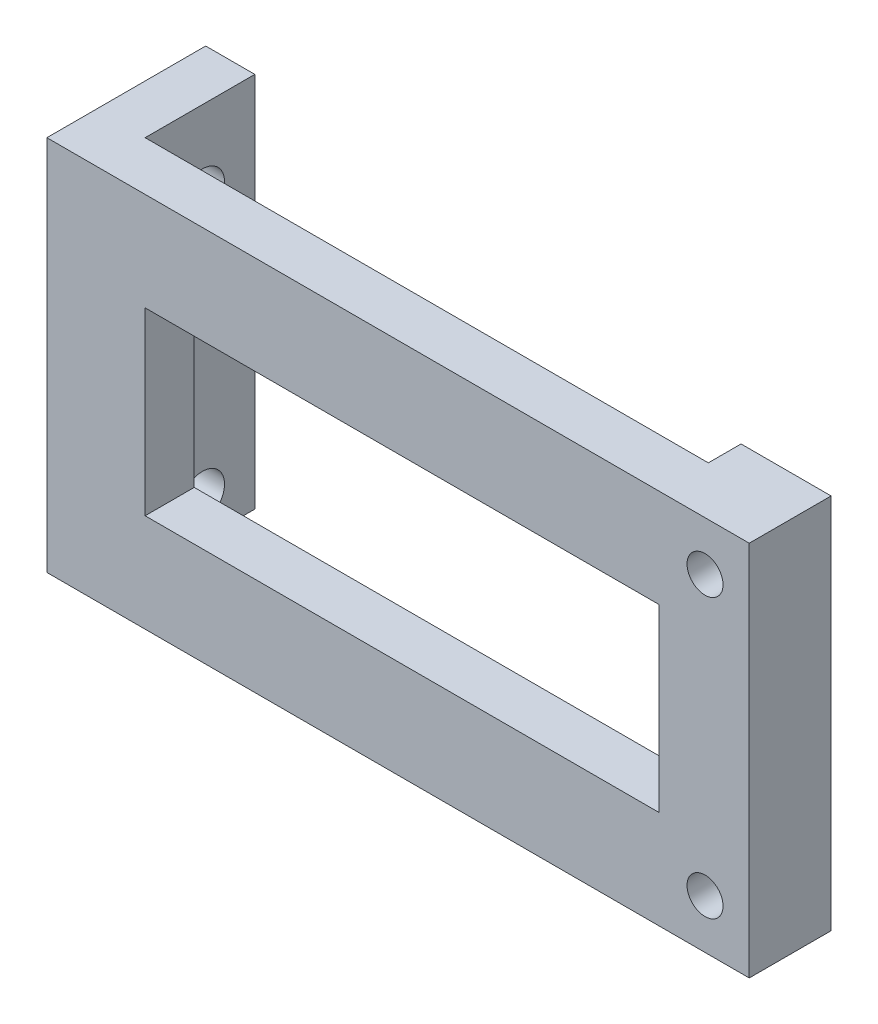
ISO-10303-21;
HEADER;
FILE_DESCRIPTION(('STEP AP214'),'2;1');
FILE_NAME('part.step','',(''),(''),'','','');
FILE_SCHEMA(('AUTOMOTIVE_DESIGN { 1 0 10303 214 1 1 1 1 }'));
ENDSEC;
DATA;
#1=APPLICATION_CONTEXT('core data for automotive mechanical design processes');
#2=APPLICATION_PROTOCOL_DEFINITION('international standard','automotive_design',2000,#1);
#3=PRODUCT_CONTEXT('',#1,'mechanical');
#4=PRODUCT('Part','Part','',(#3));
#5=PRODUCT_RELATED_PRODUCT_CATEGORY('part','',(#4));
#6=PRODUCT_DEFINITION_FORMATION('','',#4);
#7=PRODUCT_DEFINITION_CONTEXT('part definition',#1,'design');
#8=PRODUCT_DEFINITION('design','',#6,#7);
#9=PRODUCT_DEFINITION_SHAPE('','',#8);
#10=(LENGTH_UNIT() NAMED_UNIT(*) SI_UNIT(.MILLI.,.METRE.));
#11=(NAMED_UNIT(*) PLANE_ANGLE_UNIT() SI_UNIT($,.RADIAN.));
#12=(NAMED_UNIT(*) SI_UNIT($,.STERADIAN.) SOLID_ANGLE_UNIT());
#13=UNCERTAINTY_MEASURE_WITH_UNIT(LENGTH_MEASURE(1.E-05),#10,'distance_accuracy_value','');
#14=(GEOMETRIC_REPRESENTATION_CONTEXT(3) GLOBAL_UNCERTAINTY_ASSIGNED_CONTEXT((#13)) GLOBAL_UNIT_ASSIGNED_CONTEXT((#10,
#11,#12)) REPRESENTATION_CONTEXT('',''));
#15=CARTESIAN_POINT('',(0.,0.,0.));
#16=DIRECTION('',(0.,0.,1.));
#17=DIRECTION('',(1.,0.,0.));
#18=AXIS2_PLACEMENT_3D('',#15,#16,#17);
#19=CARTESIAN_POINT('',(0.,-5.50000000000001,-3.00000000000004));
#20=DIRECTION('',(0.,-1.,0.));
#21=DIRECTION('',(0.,0.,-1.));
#22=AXIS2_PLACEMENT_3D('',#19,#20,#21);
#23=PLANE('',#22);
#24=DIRECTION('',(1.,0.,0.));
#25=VECTOR('',#24,1.);
#26=CARTESIAN_POINT('',(0.,-5.50000000000017,0.));
#27=LINE('',#26,#25);
#28=CARTESIAN_POINT('',(-15.45,-5.50000000000014,0.));
#29=VERTEX_POINT('',#28);
#30=CARTESIAN_POINT('',(15.9500000000002,-5.50000000000017,0.));
#31=VERTEX_POINT('',#30);
#32=EDGE_CURVE('E75',#29,#31,#27,.T.);
#33=ORIENTED_EDGE('',*,*,#32,.T.);
#34=DIRECTION('',(0.,0.,1.));
#35=VECTOR('',#34,1.);
#36=CARTESIAN_POINT('',(15.95,-5.50000000000017,-3.));
#37=LINE('',#36,#35);
#38=CARTESIAN_POINT('',(15.95,-5.50000000000017,-3.));
#39=VERTEX_POINT('',#38);
#40=EDGE_CURVE('E11',#39,#31,#37,.T.);
#41=ORIENTED_EDGE('',*,*,#40,.F.);
#42=DIRECTION('',(1.,0.,0.));
#43=VECTOR('',#42,1.);
#44=CARTESIAN_POINT('',(0.,-5.50000000000001,-3.00000000000004));
#45=LINE('',#44,#43);
#46=CARTESIAN_POINT('',(-15.4499999999999,-5.50000000000014,-2.99999999999996));
#47=VERTEX_POINT('',#46);
#48=EDGE_CURVE('E54',#47,#39,#45,.T.);
#49=ORIENTED_EDGE('',*,*,#48,.F.);
#50=DIRECTION('',(0.,0.,1.));
#51=VECTOR('',#50,1.);
#52=CARTESIAN_POINT('',(-15.4499999999999,-5.50000000000014,-2.99999999999996));
#53=LINE('',#52,#51);
#54=EDGE_CURVE('E39',#47,#29,#53,.T.);
#55=ORIENTED_EDGE('',*,*,#54,.T.);
#56=EDGE_LOOP('',(#33,#41,#49,#55));
#57=FACE_BOUND('',#56,.T.);
#58=ADVANCED_FACE('F36',(#57),#23,.F.);
#59=CARTESIAN_POINT('',(0.,-11.5,-3.));
#60=DIRECTION('',(0.,1.,0.));
#61=DIRECTION('',(-1.,0.,0.));
#62=AXIS2_PLACEMENT_3D('',#59,#60,#61);
#63=PLANE('',#62);
#64=DIRECTION('',(-1.,0.,0.));
#65=VECTOR('',#64,1.);
#66=CARTESIAN_POINT('',(0.,-11.5000000000002,0.));
#67=LINE('',#66,#65);
#68=CARTESIAN_POINT('',(21.4500000000002,-11.5000000000001,0.));
#69=VERTEX_POINT('',#68);
#70=CARTESIAN_POINT('',(-21.45,-11.5,0.));
#71=VERTEX_POINT('',#70);
#72=EDGE_CURVE('E176',#69,#71,#67,.T.);
#73=ORIENTED_EDGE('',*,*,#72,.T.);
#74=DIRECTION('',(0.,0.,1.));
#75=VECTOR('',#74,1.);
#76=CARTESIAN_POINT('',(-21.4499999999999,-11.5,-9.7));
#77=LINE('',#76,#75);
#78=CARTESIAN_POINT('',(-21.4499999999999,-11.5,-9.7));
#79=VERTEX_POINT('',#78);
#80=EDGE_CURVE('E128',#79,#71,#77,.T.);
#81=ORIENTED_EDGE('',*,*,#80,.F.);
#82=DIRECTION('',(-1.,0.,0.));
#83=VECTOR('',#82,1.);
#84=CARTESIAN_POINT('',(1.66533453693773E-13,-11.5000000000002,-9.70000000000001));
#85=LINE('',#84,#83);
#86=CARTESIAN_POINT('',(-18.45,-11.5,-9.7));
#87=VERTEX_POINT('',#86);
#88=EDGE_CURVE('E125',#87,#79,#85,.T.);
#89=ORIENTED_EDGE('',*,*,#88,.F.);
#90=DIRECTION('',(0.,0.,1.));
#91=VECTOR('',#90,1.);
#92=CARTESIAN_POINT('',(-18.45,-11.5,-9.7));
#93=LINE('',#92,#91);
#94=CARTESIAN_POINT('',(-18.45,-11.5000000000002,-3.));
#95=VERTEX_POINT('',#94);
#96=EDGE_CURVE('E157',#87,#95,#93,.T.);
#97=ORIENTED_EDGE('',*,*,#96,.T.);
#98=DIRECTION('',(-1.,0.,0.));
#99=VECTOR('',#98,1.);
#100=CARTESIAN_POINT('',(0.,-11.5,-3.));
#101=LINE('',#100,#99);
#102=CARTESIAN_POINT('',(15.9500000000002,-11.5000000000002,-3.));
#103=VERTEX_POINT('',#102);
#104=EDGE_CURVE('E100',#103,#95,#101,.T.);
#105=ORIENTED_EDGE('',*,*,#104,.F.);
#106=DIRECTION('',(0.,0.,1.));
#107=VECTOR('',#106,1.);
#108=CARTESIAN_POINT('',(15.9500000000002,-11.5000000000002,-5.));
#109=LINE('',#108,#107);
#110=CARTESIAN_POINT('',(15.9500000000002,-11.5000000000002,-5.));
#111=VERTEX_POINT('',#110);
#112=EDGE_CURVE('E171',#111,#103,#109,.T.);
#113=ORIENTED_EDGE('',*,*,#112,.F.);
#114=DIRECTION('',(-1.,0.,0.));
#115=VECTOR('',#114,1.);
#116=CARTESIAN_POINT('',(1.66533453693773E-13,-11.5,-5.));
#117=LINE('',#116,#115);
#118=CARTESIAN_POINT('',(21.4500000000002,-11.5000000000001,-5.));
#119=VERTEX_POINT('',#118);
#120=EDGE_CURVE('E147',#119,#111,#117,.T.);
#121=ORIENTED_EDGE('',*,*,#120,.F.);
#122=DIRECTION('',(0.,0.,1.));
#123=VECTOR('',#122,1.);
#124=CARTESIAN_POINT('',(21.4500000000002,-11.5000000000001,-5.));
#125=LINE('',#124,#123);
#126=EDGE_CURVE('E168',#119,#69,#125,.T.);
#127=ORIENTED_EDGE('',*,*,#126,.T.);
#128=EDGE_LOOP('',(#73,#81,#89,#97,#105,#113,#121,#127));
#129=FACE_BOUND('',#128,.T.);
#130=ADVANCED_FACE('F200',(#129),#63,.F.);
#131=CARTESIAN_POINT('',(1.66533453693773E-13,11.5,-3.));
#132=DIRECTION('',(0.,1.,0.));
#133=DIRECTION('',(-1.,0.,0.));
#134=AXIS2_PLACEMENT_3D('',#131,#132,#133);
#135=PLANE('',#134);
#136=DIRECTION('',(-1.,0.,0.));
#137=VECTOR('',#136,1.);
#138=CARTESIAN_POINT('',(1.66533453693773E-13,11.4999999999998,0.));
#139=LINE('',#138,#137);
#140=CARTESIAN_POINT('',(21.45,11.4999999999998,0.));
#141=VERTEX_POINT('',#140);
#142=CARTESIAN_POINT('',(-21.45,11.5,0.));
#143=VERTEX_POINT('',#142);
#144=EDGE_CURVE('E190',#141,#143,#139,.T.);
#145=ORIENTED_EDGE('',*,*,#144,.F.);
#146=DIRECTION('',(0.,0.,1.));
#147=VECTOR('',#146,1.);
#148=CARTESIAN_POINT('',(21.4500000000002,11.4999999999998,-4.99999999999996));
#149=LINE('',#148,#147);
#150=CARTESIAN_POINT('',(21.4500000000002,11.4999999999998,-4.99999999999996));
#151=VERTEX_POINT('',#150);
#152=EDGE_CURVE('E165',#151,#141,#149,.T.);
#153=ORIENTED_EDGE('',*,*,#152,.F.);
#154=DIRECTION('',(-1.,0.,0.));
#155=VECTOR('',#154,1.);
#156=CARTESIAN_POINT('',(1.66533453693773E-13,11.5,-5.));
#157=LINE('',#156,#155);
#158=CARTESIAN_POINT('',(15.9500000000002,11.4999999999998,-4.99999999999996));
#159=VERTEX_POINT('',#158);
#160=EDGE_CURVE('E142',#151,#159,#157,.T.);
#161=ORIENTED_EDGE('',*,*,#160,.T.);
#162=DIRECTION('',(0.,0.,1.));
#163=VECTOR('',#162,1.);
#164=CARTESIAN_POINT('',(15.9500000000002,11.4999999999998,-4.99999999999996));
#165=LINE('',#164,#163);
#166=CARTESIAN_POINT('',(15.95,11.4999999999998,-3.));
#167=VERTEX_POINT('',#166);
#168=EDGE_CURVE('E117',#159,#167,#165,.T.);
#169=ORIENTED_EDGE('',*,*,#168,.T.);
#170=DIRECTION('',(-1.,0.,0.));
#171=VECTOR('',#170,1.);
#172=CARTESIAN_POINT('',(1.66533453693773E-13,11.5,-3.));
#173=LINE('',#172,#171);
#174=CARTESIAN_POINT('',(-18.4499999999997,11.4999999999998,-3.));
#175=VERTEX_POINT('',#174);
#176=EDGE_CURVE('E96',#167,#175,#173,.T.);
#177=ORIENTED_EDGE('',*,*,#176,.T.);
#178=DIRECTION('',(0.,0.,1.));
#179=VECTOR('',#178,1.);
#180=CARTESIAN_POINT('',(-18.45,11.4999999999998,-9.7));
#181=LINE('',#180,#179);
#182=CARTESIAN_POINT('',(-18.45,11.4999999999998,-9.7));
#183=VERTEX_POINT('',#182);
#184=EDGE_CURVE('E113',#183,#175,#181,.T.);
#185=ORIENTED_EDGE('',*,*,#184,.F.);
#186=DIRECTION('',(-1.,0.,0.));
#187=VECTOR('',#186,1.);
#188=CARTESIAN_POINT('',(0.,11.4999999999998,-9.7));
#189=LINE('',#188,#187);
#190=CARTESIAN_POINT('',(-21.45,11.5,-9.7));
#191=VERTEX_POINT('',#190);
#192=EDGE_CURVE('E251',#183,#191,#189,.T.);
#193=ORIENTED_EDGE('',*,*,#192,.T.);
#194=DIRECTION('',(0.,0.,1.));
#195=VECTOR('',#194,1.);
#196=CARTESIAN_POINT('',(-21.45,11.5,-9.7));
#197=LINE('',#196,#195);
#198=EDGE_CURVE('E124',#191,#143,#197,.T.);
#199=ORIENTED_EDGE('',*,*,#198,.T.);
#200=EDGE_LOOP('',(#145,#153,#161,#169,#177,#185,#193,#199));
#201=FACE_BOUND('',#200,.T.);
#202=ADVANCED_FACE('F110',(#201),#135,.T.);
#203=CARTESIAN_POINT('',(1.38777878078145E-13,5.49999999999984,-3.));
#204=DIRECTION('',(0.,-1.,0.));
#205=DIRECTION('',(1.,0.,0.));
#206=AXIS2_PLACEMENT_3D('',#203,#204,#205);
#207=PLANE('',#206);
#208=DIRECTION('',(1.,0.,0.));
#209=VECTOR('',#208,1.);
#210=CARTESIAN_POINT('',(1.66533453693773E-13,5.49999999999967,0.));
#211=LINE('',#210,#209);
#212=CARTESIAN_POINT('',(-15.45,5.49999999999984,0.));
#213=VERTEX_POINT('',#212);
#214=CARTESIAN_POINT('',(15.95,5.49999999999984,0.));
#215=VERTEX_POINT('',#214);
#216=EDGE_CURVE('E187',#213,#215,#211,.T.);
#217=ORIENTED_EDGE('',*,*,#216,.F.);
#218=DIRECTION('',(0.,0.,1.));
#219=VECTOR('',#218,1.);
#220=CARTESIAN_POINT('',(-15.45,5.49999999999984,-3.));
#221=LINE('',#220,#219);
#222=CARTESIAN_POINT('',(-15.45,5.49999999999984,-3.));
#223=VERTEX_POINT('',#222);
#224=EDGE_CURVE('E68',#223,#213,#221,.T.);
#225=ORIENTED_EDGE('',*,*,#224,.F.);
#226=DIRECTION('',(1.,0.,0.));
#227=VECTOR('',#226,1.);
#228=CARTESIAN_POINT('',(1.38777878078145E-13,5.49999999999984,-3.));
#229=LINE('',#228,#227);
#230=CARTESIAN_POINT('',(15.9500000000002,5.49999999999984,-3.));
#231=VERTEX_POINT('',#230);
#232=EDGE_CURVE('E178',#223,#231,#229,.T.);
#233=ORIENTED_EDGE('',*,*,#232,.T.);
#234=DIRECTION('',(0.,0.,1.));
#235=VECTOR('',#234,1.);
#236=CARTESIAN_POINT('',(15.9500000000002,5.49999999999984,-3.));
#237=LINE('',#236,#235);
#238=EDGE_CURVE('E45',#231,#215,#237,.T.);
#239=ORIENTED_EDGE('',*,*,#238,.T.);
#240=EDGE_LOOP('',(#217,#225,#233,#239));
#241=FACE_BOUND('',#240,.T.);
#242=ADVANCED_FACE('F291',(#241),#207,.T.);
#243=CARTESIAN_POINT('',(-15.45,-1.66533453693773E-13,-3.));
#244=DIRECTION('',(-1.,0.,0.));
#245=DIRECTION('',(0.,0.,1.));
#246=AXIS2_PLACEMENT_3D('',#243,#244,#245);
#247=PLANE('',#246);
#248=DIRECTION('',(0.,-1.,0.));
#249=VECTOR('',#248,1.);
#250=CARTESIAN_POINT('',(-15.45,-1.66533453693773E-13,0.));
#251=LINE('',#250,#249);
#252=EDGE_CURVE('E185',#213,#29,#251,.T.);
#253=ORIENTED_EDGE('',*,*,#252,.T.);
#254=ORIENTED_EDGE('',*,*,#54,.F.);
#255=DIRECTION('',(0.,-1.,0.));
#256=VECTOR('',#255,1.);
#257=CARTESIAN_POINT('',(-15.45,-1.66533453693773E-13,-3.));
#258=LINE('',#257,#256);
#259=EDGE_CURVE('E79',#223,#47,#258,.T.);
#260=ORIENTED_EDGE('',*,*,#259,.F.);
#261=ORIENTED_EDGE('',*,*,#224,.T.);
#262=EDGE_LOOP('',(#253,#254,#260,#261));
#263=FACE_BOUND('',#262,.T.);
#264=ADVANCED_FACE('F296',(#263),#247,.F.);
#265=CARTESIAN_POINT('',(0.,-1.66533453693773E-13,-3.));
#266=DIRECTION('',(0.,0.,1.));
#267=DIRECTION('',(1.,0.,0.));
#268=AXIS2_PLACEMENT_3D('',#265,#266,#267);
#269=PLANE('',#268);
#270=ORIENTED_EDGE('',*,*,#48,.T.);
#271=DIRECTION('',(0.,-1.,0.));
#272=VECTOR('',#271,1.);
#273=CARTESIAN_POINT('',(15.9500000000002,-1.66533453693773E-13,-3.));
#274=LINE('',#273,#272);
#275=EDGE_CURVE('E181',#39,#103,#274,.T.);
#276=ORIENTED_EDGE('',*,*,#275,.T.);
#277=ORIENTED_EDGE('',*,*,#104,.T.);
#278=DIRECTION('',(0.,-1.,0.));
#279=VECTOR('',#278,1.);
#280=CARTESIAN_POINT('',(-18.45,-1.66533453693773E-13,-3.));
#281=LINE('',#280,#279);
#282=EDGE_CURVE('E93',#175,#95,#281,.T.);
#283=ORIENTED_EDGE('',*,*,#282,.F.);
#284=ORIENTED_EDGE('',*,*,#176,.F.);
#285=EDGE_CURVE('E118',#167,#231,#274,.T.);
#286=ORIENTED_EDGE('',*,*,#285,.T.);
#287=ORIENTED_EDGE('',*,*,#232,.F.);
#288=ORIENTED_EDGE('',*,*,#259,.T.);
#289=EDGE_LOOP('',(#270,#276,#277,#283,#284,#286,#287,#288));
#290=FACE_BOUND('',#289,.T.);
#291=ADVANCED_FACE('F95',(#290),#269,.F.);
#292=CARTESIAN_POINT('',(0.,0.,0.));
#293=DIRECTION('',(0.,0.,1.));
#294=DIRECTION('',(1.,0.,0.));
#295=AXIS2_PLACEMENT_3D('',#292,#293,#294);
#296=PLANE('',#295);
#297=ORIENTED_EDGE('',*,*,#216,.T.);
#298=DIRECTION('',(0.,-1.,0.));
#299=VECTOR('',#298,1.);
#300=CARTESIAN_POINT('',(15.9500000000002,0.,0.));
#301=LINE('',#300,#299);
#302=EDGE_CURVE('E160',#215,#31,#301,.T.);
#303=ORIENTED_EDGE('',*,*,#302,.T.);
#304=ORIENTED_EDGE('',*,*,#32,.F.);
#305=ORIENTED_EDGE('',*,*,#252,.F.);
#306=EDGE_LOOP('',(#297,#303,#304,#305));
#307=FACE_BOUND('',#306,.T.);
#308=DIRECTION('',(0.,-1.,0.));
#309=VECTOR('',#308,1.);
#310=CARTESIAN_POINT('',(21.4500000000002,-1.66533453693773E-13,0.));
#311=LINE('',#310,#309);
#312=EDGE_CURVE('E139',#141,#69,#311,.T.);
#313=ORIENTED_EDGE('',*,*,#312,.F.);
#314=ORIENTED_EDGE('',*,*,#144,.T.);
#315=DIRECTION('',(0.,-1.,0.));
#316=VECTOR('',#315,1.);
#317=CARTESIAN_POINT('',(-21.4499999999997,-1.66533453693773E-13,0.));
#318=LINE('',#317,#316);
#319=EDGE_CURVE('E248',#143,#71,#318,.T.);
#320=ORIENTED_EDGE('',*,*,#319,.T.);
#321=ORIENTED_EDGE('',*,*,#72,.F.);
#322=EDGE_LOOP('',(#313,#314,#320,#321));
#323=FACE_BOUND('',#322,.T.);
#324=CARTESIAN_POINT('',(18.7500000000002,8.49999999999998,0.));
#325=DIRECTION('',(0.,0.,1.));
#326=DIRECTION('',(1.,0.,0.));
#327=AXIS2_PLACEMENT_3D('',#324,#325,#326);
#328=CIRCLE('',#327,1.1);
#329=CARTESIAN_POINT('',(19.8500000000002,8.49999999999998,0.));
#330=VERTEX_POINT('',#329);
#331=EDGE_CURVE('E153',#330,#330,#328,.T.);
#332=ORIENTED_EDGE('',*,*,#331,.F.);
#333=EDGE_LOOP('',(#332));
#334=FACE_BOUND('',#333,.T.);
#335=CARTESIAN_POINT('',(18.75,-8.50000000000001,0.));
#336=DIRECTION('',(0.,0.,1.));
#337=DIRECTION('',(1.,0.,0.));
#338=AXIS2_PLACEMENT_3D('',#335,#336,#337);
#339=CIRCLE('',#338,1.1);
#340=CARTESIAN_POINT('',(19.85,-8.50000000000001,0.));
#341=VERTEX_POINT('',#340);
#342=EDGE_CURVE('E156',#341,#341,#339,.T.);
#343=ORIENTED_EDGE('',*,*,#342,.F.);
#344=EDGE_LOOP('',(#343));
#345=FACE_BOUND('',#344,.T.);
#346=ADVANCED_FACE('F260',(#307,#323,#334,#345),#296,.T.);
#347=CARTESIAN_POINT('',(15.95,-1.66533453693773E-13,-5.));
#348=DIRECTION('',(-1.,0.,0.));
#349=DIRECTION('',(0.,-1.,0.));
#350=AXIS2_PLACEMENT_3D('',#347,#348,#349);
#351=PLANE('',#350);
#352=ORIENTED_EDGE('',*,*,#302,.F.);
#353=ORIENTED_EDGE('',*,*,#238,.F.);
#354=ORIENTED_EDGE('',*,*,#285,.F.);
#355=ORIENTED_EDGE('',*,*,#168,.F.);
#356=DIRECTION('',(0.,-1.,0.));
#357=VECTOR('',#356,1.);
#358=CARTESIAN_POINT('',(15.95,-1.66533453693773E-13,-5.));
#359=LINE('',#358,#357);
#360=EDGE_CURVE('E144',#159,#111,#359,.T.);
#361=ORIENTED_EDGE('',*,*,#360,.T.);
#362=ORIENTED_EDGE('',*,*,#112,.T.);
#363=ORIENTED_EDGE('',*,*,#275,.F.);
#364=ORIENTED_EDGE('',*,*,#40,.T.);
#365=EDGE_LOOP('',(#352,#353,#354,#355,#361,#362,#363,#364));
#366=FACE_BOUND('',#365,.T.);
#367=ADVANCED_FACE('F205',(#366),#351,.T.);
#368=CARTESIAN_POINT('',(21.4500000000002,-1.66533453693773E-13,-4.99999999999996));
#369=DIRECTION('',(-1.,0.,0.));
#370=DIRECTION('',(0.,-1.,0.));
#371=AXIS2_PLACEMENT_3D('',#368,#369,#370);
#372=PLANE('',#371);
#373=ORIENTED_EDGE('',*,*,#312,.T.);
#374=ORIENTED_EDGE('',*,*,#126,.F.);
#375=DIRECTION('',(0.,-1.,0.));
#376=VECTOR('',#375,1.);
#377=CARTESIAN_POINT('',(21.4500000000002,-1.66533453693773E-13,-4.99999999999996));
#378=LINE('',#377,#376);
#379=EDGE_CURVE('E150',#151,#119,#378,.T.);
#380=ORIENTED_EDGE('',*,*,#379,.F.);
#381=ORIENTED_EDGE('',*,*,#152,.T.);
#382=EDGE_LOOP('',(#373,#374,#380,#381));
#383=FACE_BOUND('',#382,.T.);
#384=ADVANCED_FACE('F222',(#383),#372,.F.);
#385=CARTESIAN_POINT('',(18.75,-8.50000000000017,-5.));
#386=DIRECTION('',(0.,0.,1.));
#387=DIRECTION('',(1.,0.,0.));
#388=AXIS2_PLACEMENT_3D('',#385,#386,#387);
#389=CYLINDRICAL_SURFACE('',#388,1.1);
#390=CARTESIAN_POINT('',(18.75,-8.50000000000017,-5.));
#391=DIRECTION('',(0.,0.,1.));
#392=DIRECTION('',(1.,0.,0.));
#393=AXIS2_PLACEMENT_3D('',#390,#391,#392);
#394=CIRCLE('',#393,1.1);
#395=CARTESIAN_POINT('',(19.85,-8.50000000000017,-5.));
#396=VERTEX_POINT('',#395);
#397=EDGE_CURVE('E138',#396,#396,#394,.T.);
#398=ORIENTED_EDGE('',*,*,#397,.F.);
#399=EDGE_LOOP('',(#398));
#400=FACE_BOUND('',#399,.T.);
#401=ORIENTED_EDGE('',*,*,#342,.T.);
#402=EDGE_LOOP('',(#401));
#403=FACE_BOUND('',#402,.T.);
#404=ADVANCED_FACE('F269',(#400,#403),#389,.F.);
#405=CARTESIAN_POINT('',(18.75,8.49999999999981,-5.));
#406=DIRECTION('',(0.,0.,1.));
#407=DIRECTION('',(1.,0.,0.));
#408=AXIS2_PLACEMENT_3D('',#405,#406,#407);
#409=CYLINDRICAL_SURFACE('',#408,1.1);
#410=CARTESIAN_POINT('',(18.75,8.49999999999981,-5.));
#411=DIRECTION('',(0.,0.,1.));
#412=DIRECTION('',(1.,0.,0.));
#413=AXIS2_PLACEMENT_3D('',#410,#411,#412);
#414=CIRCLE('',#413,1.1);
#415=CARTESIAN_POINT('',(19.85,8.49999999999981,-5.));
#416=VERTEX_POINT('',#415);
#417=EDGE_CURVE('E135',#416,#416,#414,.T.);
#418=ORIENTED_EDGE('',*,*,#417,.F.);
#419=EDGE_LOOP('',(#418));
#420=FACE_BOUND('',#419,.T.);
#421=ORIENTED_EDGE('',*,*,#331,.T.);
#422=EDGE_LOOP('',(#421));
#423=FACE_BOUND('',#422,.T.);
#424=ADVANCED_FACE('F271',(#420,#423),#409,.F.);
#425=CARTESIAN_POINT('',(0.,-1.66533453693773E-13,-5.));
#426=DIRECTION('',(0.,0.,1.));
#427=DIRECTION('',(1.,0.,0.));
#428=AXIS2_PLACEMENT_3D('',#425,#426,#427);
#429=PLANE('',#428);
#430=ORIENTED_EDGE('',*,*,#417,.T.);
#431=EDGE_LOOP('',(#430));
#432=FACE_BOUND('',#431,.T.);
#433=ORIENTED_EDGE('',*,*,#397,.T.);
#434=EDGE_LOOP('',(#433));
#435=FACE_BOUND('',#434,.T.);
#436=ORIENTED_EDGE('',*,*,#160,.F.);
#437=ORIENTED_EDGE('',*,*,#379,.T.);
#438=ORIENTED_EDGE('',*,*,#120,.T.);
#439=ORIENTED_EDGE('',*,*,#360,.F.);
#440=EDGE_LOOP('',(#436,#437,#438,#439));
#441=FACE_BOUND('',#440,.T.);
#442=ADVANCED_FACE('F212',(#432,#435,#441),#429,.F.);
#443=CARTESIAN_POINT('',(-18.45,-3.33066907387547E-13,-9.7));
#444=DIRECTION('',(-1.,0.,0.));
#445=DIRECTION('',(0.,-1.,0.));
#446=AXIS2_PLACEMENT_3D('',#443,#444,#445);
#447=PLANE('',#446);
#448=CARTESIAN_POINT('',(-18.45,-9.25000000000034,-6.5));
#449=DIRECTION('',(-1.,0.,0.));
#450=DIRECTION('',(0.,-1.,0.));
#451=AXIS2_PLACEMENT_3D('',#448,#449,#450);
#452=CIRCLE('',#451,1.35);
#453=CARTESIAN_POINT('',(-18.45,-10.6000000000003,-6.5));
#454=VERTEX_POINT('',#453);
#455=EDGE_CURVE('E394',#454,#454,#452,.F.);
#456=ORIENTED_EDGE('',*,*,#455,.F.);
#457=EDGE_LOOP('',(#456));
#458=FACE_BOUND('',#457,.T.);
#459=CARTESIAN_POINT('',(-18.45,6.74999999999967,-6.5));
#460=DIRECTION('',(-1.,0.,0.));
#461=DIRECTION('',(0.,-1.,0.));
#462=AXIS2_PLACEMENT_3D('',#459,#460,#461);
#463=CIRCLE('',#462,1.35);
#464=CARTESIAN_POINT('',(-18.45,5.39999999999967,-6.5));
#465=VERTEX_POINT('',#464);
#466=EDGE_CURVE('E259',#465,#465,#463,.F.);
#467=ORIENTED_EDGE('',*,*,#466,.F.);
#468=EDGE_LOOP('',(#467));
#469=FACE_BOUND('',#468,.T.);
#470=ORIENTED_EDGE('',*,*,#184,.T.);
#471=ORIENTED_EDGE('',*,*,#282,.T.);
#472=ORIENTED_EDGE('',*,*,#96,.F.);
#473=DIRECTION('',(0.,-1.,0.));
#474=VECTOR('',#473,1.);
#475=CARTESIAN_POINT('',(-18.45,-3.33066907387547E-13,-9.7));
#476=LINE('',#475,#474);
#477=EDGE_CURVE('E122',#183,#87,#476,.T.);
#478=ORIENTED_EDGE('',*,*,#477,.F.);
#479=EDGE_LOOP('',(#470,#471,#472,#478));
#480=FACE_BOUND('',#479,.T.);
#481=ADVANCED_FACE('F120',(#458,#469,#480),#447,.F.);
#482=CARTESIAN_POINT('',(-21.4500000000003,0.,-9.7));
#483=DIRECTION('',(-1.,0.,0.));
#484=DIRECTION('',(0.,-1.,0.));
#485=AXIS2_PLACEMENT_3D('',#482,#483,#484);
#486=PLANE('',#485);
#487=CARTESIAN_POINT('',(-21.45,-9.25000000000034,-6.5));
#488=DIRECTION('',(-1.,0.,0.));
#489=DIRECTION('',(0.,-1.,0.));
#490=AXIS2_PLACEMENT_3D('',#487,#488,#489);
#491=CIRCLE('',#490,1.35);
#492=CARTESIAN_POINT('',(-21.45,-10.6000000000003,-6.5));
#493=VERTEX_POINT('',#492);
#494=EDGE_CURVE('E397',#493,#493,#491,.T.);
#495=ORIENTED_EDGE('',*,*,#494,.F.);
#496=EDGE_LOOP('',(#495));
#497=FACE_BOUND('',#496,.T.);
#498=CARTESIAN_POINT('',(-21.4500000000003,6.74999999999984,-6.49999999999998));
#499=DIRECTION('',(-1.,0.,0.));
#500=DIRECTION('',(0.,-1.,0.));
#501=AXIS2_PLACEMENT_3D('',#498,#499,#500);
#502=CIRCLE('',#501,1.35);
#503=CARTESIAN_POINT('',(-21.4500000000003,5.39999999999984,-6.49999999999998));
#504=VERTEX_POINT('',#503);
#505=EDGE_CURVE('E399',#504,#504,#502,.T.);
#506=ORIENTED_EDGE('',*,*,#505,.F.);
#507=EDGE_LOOP('',(#506));
#508=FACE_BOUND('',#507,.T.);
#509=ORIENTED_EDGE('',*,*,#319,.F.);
#510=ORIENTED_EDGE('',*,*,#198,.F.);
#511=DIRECTION('',(0.,-1.,0.));
#512=VECTOR('',#511,1.);
#513=CARTESIAN_POINT('',(-21.4500000000003,0.,-9.7));
#514=LINE('',#513,#512);
#515=EDGE_CURVE('E131',#191,#79,#514,.T.);
#516=ORIENTED_EDGE('',*,*,#515,.T.);
#517=ORIENTED_EDGE('',*,*,#80,.T.);
#518=EDGE_LOOP('',(#509,#510,#516,#517));
#519=FACE_BOUND('',#518,.T.);
#520=ADVANCED_FACE('F246',(#497,#508,#519),#486,.T.);
#521=CARTESIAN_POINT('',(0.,0.,-9.7));
#522=DIRECTION('',(0.,0.,1.));
#523=DIRECTION('',(1.,0.,0.));
#524=AXIS2_PLACEMENT_3D('',#521,#522,#523);
#525=PLANE('',#524);
#526=ORIENTED_EDGE('',*,*,#477,.T.);
#527=ORIENTED_EDGE('',*,*,#88,.T.);
#528=ORIENTED_EDGE('',*,*,#515,.F.);
#529=ORIENTED_EDGE('',*,*,#192,.F.);
#530=EDGE_LOOP('',(#526,#527,#528,#529));
#531=FACE_BOUND('',#530,.T.);
#532=ADVANCED_FACE('F250',(#531),#525,.F.);
#533=CARTESIAN_POINT('',(-14.6316233815927,6.74999999999984,-6.5));
#534=DIRECTION('',(-1.,0.,0.));
#535=DIRECTION('',(0.,-1.,0.));
#536=AXIS2_PLACEMENT_3D('',#533,#534,#535);
#537=CYLINDRICAL_SURFACE('',#536,1.35);
#538=ORIENTED_EDGE('',*,*,#466,.T.);
#539=EDGE_LOOP('',(#538));
#540=FACE_BOUND('',#539,.T.);
#541=ORIENTED_EDGE('',*,*,#505,.T.);
#542=EDGE_LOOP('',(#541));
#543=FACE_BOUND('',#542,.T.);
#544=ADVANCED_FACE('F368',(#540,#543),#537,.F.);
#545=CARTESIAN_POINT('',(-14.6316233815925,-9.25000000000017,-6.50000000000004));
#546=DIRECTION('',(-1.,0.,0.));
#547=DIRECTION('',(0.,-1.,0.));
#548=AXIS2_PLACEMENT_3D('',#545,#546,#547);
#549=CYLINDRICAL_SURFACE('',#548,1.35);
#550=ORIENTED_EDGE('',*,*,#455,.T.);
#551=EDGE_LOOP('',(#550));
#552=FACE_BOUND('',#551,.T.);
#553=ORIENTED_EDGE('',*,*,#494,.T.);
#554=EDGE_LOOP('',(#553));
#555=FACE_BOUND('',#554,.T.);
#556=ADVANCED_FACE('F377',(#552,#555),#549,.F.);
#557=CLOSED_SHELL('',(#58,#130,#202,#242,#264,#291,#346,#367,#384,#404,#424,#442,#481,#520,#532,
#544,#556));
#558=MANIFOLD_SOLID_BREP('B2',#557);
#559=ADVANCED_BREP_SHAPE_REPRESENTATION('',(#18,#558),#14);
#560=SHAPE_DEFINITION_REPRESENTATION(#9,#559);
ENDSEC;
END-ISO-10303-21;
